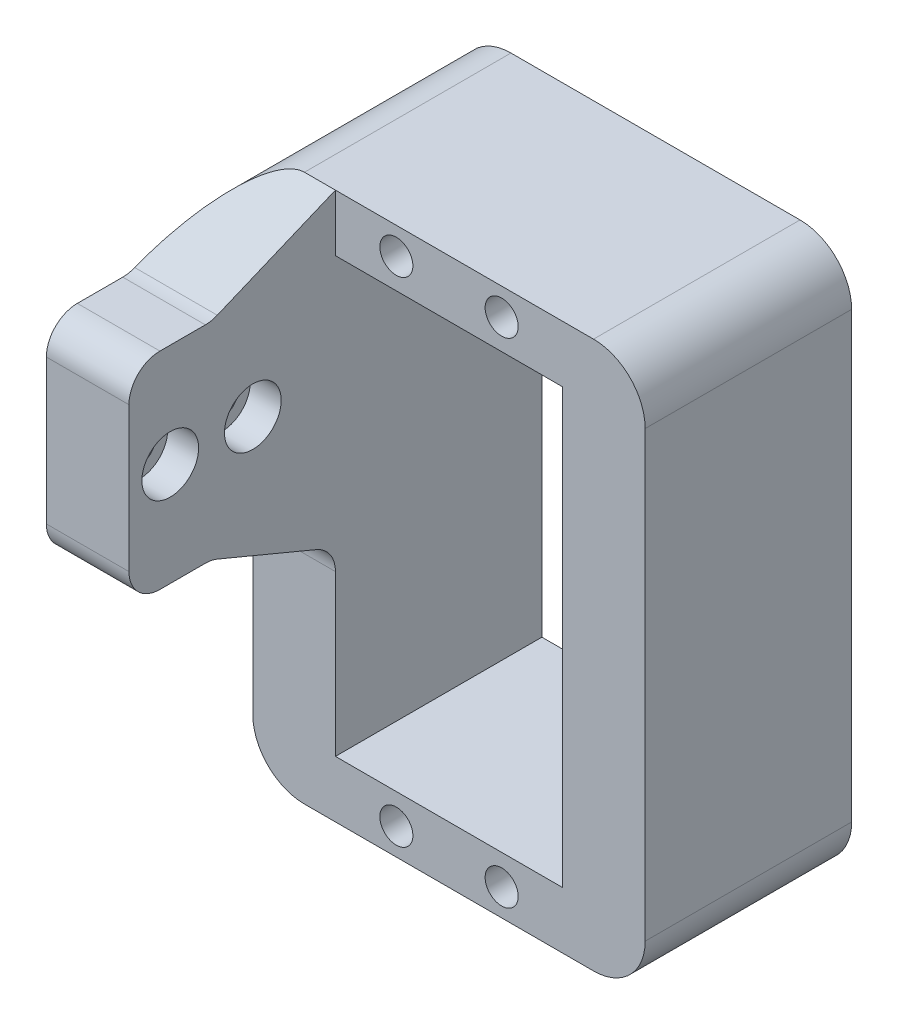
ISO-10303-21;
HEADER;
FILE_DESCRIPTION(('STEP AP214'),'2;1');
FILE_NAME('part.step','',(''),(''),'','','');
FILE_SCHEMA(('AUTOMOTIVE_DESIGN { 1 0 10303 214 1 1 1 1 }'));
ENDSEC;
DATA;
#1=APPLICATION_CONTEXT('core data for automotive mechanical design processes');
#2=APPLICATION_PROTOCOL_DEFINITION('international standard','automotive_design',2000,#1);
#3=PRODUCT_CONTEXT('',#1,'mechanical');
#4=PRODUCT('Part','Part','',(#3));
#5=PRODUCT_RELATED_PRODUCT_CATEGORY('part','',(#4));
#6=PRODUCT_DEFINITION_FORMATION('','',#4);
#7=PRODUCT_DEFINITION_CONTEXT('part definition',#1,'design');
#8=PRODUCT_DEFINITION('design','',#6,#7);
#9=PRODUCT_DEFINITION_SHAPE('','',#8);
#10=(LENGTH_UNIT() NAMED_UNIT(*) SI_UNIT(.MILLI.,.METRE.));
#11=(NAMED_UNIT(*) PLANE_ANGLE_UNIT() SI_UNIT($,.RADIAN.));
#12=(NAMED_UNIT(*) SI_UNIT($,.STERADIAN.) SOLID_ANGLE_UNIT());
#13=UNCERTAINTY_MEASURE_WITH_UNIT(LENGTH_MEASURE(1.E-05),#10,'distance_accuracy_value','');
#14=(GEOMETRIC_REPRESENTATION_CONTEXT(3) GLOBAL_UNCERTAINTY_ASSIGNED_CONTEXT((#13)) GLOBAL_UNIT_ASSIGNED_CONTEXT((#10,
#11,#12)) REPRESENTATION_CONTEXT('',''));
#15=CARTESIAN_POINT('',(0.,0.,0.));
#16=DIRECTION('',(0.,0.,1.));
#17=DIRECTION('',(1.,0.,0.));
#18=AXIS2_PLACEMENT_3D('',#15,#16,#17);
#19=CARTESIAN_POINT('',(0.,0.,20.));
#20=DIRECTION('',(0.,0.,1.));
#21=DIRECTION('',(1.,0.,0.));
#22=AXIS2_PLACEMENT_3D('',#19,#20,#21);
#23=PLANE('',#22);
#24=DIRECTION('',(0.,-1.,0.));
#25=VECTOR('',#24,1.);
#26=CARTESIAN_POINT('',(-19.,26.5,20.));
#27=LINE('',#26,#25);
#28=CARTESIAN_POINT('',(-19.,-5.5,20.));
#29=VERTEX_POINT('',#28);
#30=CARTESIAN_POINT('',(-19.,-21.5,20.));
#31=VERTEX_POINT('',#30);
#32=EDGE_CURVE('E199',#29,#31,#27,.T.);
#33=ORIENTED_EDGE('',*,*,#32,.T.);
#34=CARTESIAN_POINT('',(-14.,-21.5,20.));
#35=DIRECTION('',(0.,0.,1.));
#36=DIRECTION('',(1.,0.,0.));
#37=AXIS2_PLACEMENT_3D('',#34,#35,#36);
#38=CIRCLE('',#37,5.);
#39=CARTESIAN_POINT('',(-14.,-26.5,20.));
#40=VERTEX_POINT('',#39);
#41=EDGE_CURVE('E400',#31,#40,#38,.T.);
#42=ORIENTED_EDGE('',*,*,#41,.T.);
#43=DIRECTION('',(1.,0.,0.));
#44=VECTOR('',#43,1.);
#45=CARTESIAN_POINT('',(-19.,-26.5,20.));
#46=LINE('',#45,#44);
#47=CARTESIAN_POINT('',(14.,-26.5,20.));
#48=VERTEX_POINT('',#47);
#49=EDGE_CURVE('E217',#40,#48,#46,.T.);
#50=ORIENTED_EDGE('',*,*,#49,.T.);
#51=CARTESIAN_POINT('',(14.,-21.5,20.));
#52=DIRECTION('',(0.,0.,1.));
#53=DIRECTION('',(1.,0.,0.));
#54=AXIS2_PLACEMENT_3D('',#51,#52,#53);
#55=CIRCLE('',#54,5.);
#56=CARTESIAN_POINT('',(19.,-21.5,20.));
#57=VERTEX_POINT('',#56);
#58=EDGE_CURVE('E398',#48,#57,#55,.T.);
#59=ORIENTED_EDGE('',*,*,#58,.T.);
#60=DIRECTION('',(0.,1.,0.));
#61=VECTOR('',#60,1.);
#62=CARTESIAN_POINT('',(19.,26.5,20.));
#63=LINE('',#62,#61);
#64=CARTESIAN_POINT('',(19.,21.5,20.));
#65=VERTEX_POINT('',#64);
#66=EDGE_CURVE('E200',#57,#65,#63,.T.);
#67=ORIENTED_EDGE('',*,*,#66,.T.);
#68=CARTESIAN_POINT('',(14.,21.5,20.));
#69=DIRECTION('',(0.,0.,1.));
#70=DIRECTION('',(1.,0.,0.));
#71=AXIS2_PLACEMENT_3D('',#68,#69,#70);
#72=CIRCLE('',#71,5.);
#73=CARTESIAN_POINT('',(14.,26.5,20.));
#74=VERTEX_POINT('',#73);
#75=EDGE_CURVE('E196',#65,#74,#72,.T.);
#76=ORIENTED_EDGE('',*,*,#75,.T.);
#77=DIRECTION('',(-1.,0.,0.));
#78=VECTOR('',#77,1.);
#79=CARTESIAN_POINT('',(-19.,26.5,20.));
#80=LINE('',#79,#78);
#81=CARTESIAN_POINT('',(-11.,26.5,20.));
#82=VERTEX_POINT('',#81);
#83=EDGE_CURVE('E186',#74,#82,#80,.T.);
#84=ORIENTED_EDGE('',*,*,#83,.T.);
#85=DIRECTION('',(0.,1.,0.));
#86=VECTOR('',#85,1.);
#87=CARTESIAN_POINT('',(-11.,1.5,20.));
#88=LINE('',#87,#86);
#89=CARTESIAN_POINT('',(-11.,21.,20.));
#90=VERTEX_POINT('',#89);
#91=EDGE_CURVE('E192',#90,#82,#88,.T.);
#92=ORIENTED_EDGE('',*,*,#91,.F.);
#93=DIRECTION('',(-1.,0.,0.));
#94=VECTOR('',#93,1.);
#95=CARTESIAN_POINT('',(-11.,21.,20.));
#96=LINE('',#95,#94);
#97=CARTESIAN_POINT('',(11.,21.,20.));
#98=VERTEX_POINT('',#97);
#99=EDGE_CURVE('E297',#98,#90,#96,.T.);
#100=ORIENTED_EDGE('',*,*,#99,.F.);
#101=DIRECTION('',(0.,1.,0.));
#102=VECTOR('',#101,1.);
#103=CARTESIAN_POINT('',(11.,21.,20.));
#104=LINE('',#103,#102);
#105=CARTESIAN_POINT('',(11.,-21.,20.));
#106=VERTEX_POINT('',#105);
#107=EDGE_CURVE('E295',#106,#98,#104,.T.);
#108=ORIENTED_EDGE('',*,*,#107,.F.);
#109=DIRECTION('',(1.,0.,0.));
#110=VECTOR('',#109,1.);
#111=CARTESIAN_POINT('',(-11.,-21.,20.));
#112=LINE('',#111,#110);
#113=CARTESIAN_POINT('',(-11.,-21.,20.));
#114=VERTEX_POINT('',#113);
#115=EDGE_CURVE('E302',#114,#106,#112,.T.);
#116=ORIENTED_EDGE('',*,*,#115,.F.);
#117=DIRECTION('',(0.,-1.,0.));
#118=VECTOR('',#117,1.);
#119=CARTESIAN_POINT('',(-11.,21.,20.));
#120=LINE('',#119,#118);
#121=CARTESIAN_POINT('',(-11.,-5.49999999999999,20.));
#122=VERTEX_POINT('',#121);
#123=EDGE_CURVE('E300',#122,#114,#120,.T.);
#124=ORIENTED_EDGE('',*,*,#123,.F.);
#125=DIRECTION('',(-1.,0.,0.));
#126=VECTOR('',#125,1.);
#127=CARTESIAN_POINT('',(-19.,-5.5,20.));
#128=LINE('',#127,#126);
#129=EDGE_CURVE('E357',#122,#29,#128,.T.);
#130=ORIENTED_EDGE('',*,*,#129,.T.);
#131=EDGE_LOOP('',(#33,#42,#50,#59,#67,#76,#84,#92,#100,#108,#116,#124,#130));
#132=FACE_BOUND('',#131,.T.);
#133=CARTESIAN_POINT('',(-5.1,-23.8999999999999,20.));
#134=DIRECTION('',(0.,0.,1.));
#135=DIRECTION('',(1.,0.,0.));
#136=AXIS2_PLACEMENT_3D('',#133,#134,#135);
#137=CIRCLE('',#136,1.6);
#138=CARTESIAN_POINT('',(-3.5,-23.8999999999999,20.));
#139=VERTEX_POINT('',#138);
#140=EDGE_CURVE('E249',#139,#139,#137,.T.);
#141=ORIENTED_EDGE('',*,*,#140,.F.);
#142=EDGE_LOOP('',(#141));
#143=FACE_BOUND('',#142,.T.);
#144=CARTESIAN_POINT('',(5.1,23.9000000000001,20.));
#145=DIRECTION('',(0.,0.,1.));
#146=DIRECTION('',(1.,0.,0.));
#147=AXIS2_PLACEMENT_3D('',#144,#145,#146);
#148=CIRCLE('',#147,1.6);
#149=CARTESIAN_POINT('',(6.7,23.9000000000001,20.));
#150=VERTEX_POINT('',#149);
#151=EDGE_CURVE('E246',#150,#150,#148,.T.);
#152=ORIENTED_EDGE('',*,*,#151,.F.);
#153=EDGE_LOOP('',(#152));
#154=FACE_BOUND('',#153,.T.);
#155=CARTESIAN_POINT('',(-5.1,23.9000000000001,20.));
#156=DIRECTION('',(0.,0.,1.));
#157=DIRECTION('',(1.,0.,0.));
#158=AXIS2_PLACEMENT_3D('',#155,#156,#157);
#159=CIRCLE('',#158,1.6);
#160=CARTESIAN_POINT('',(-3.5,23.9000000000001,20.));
#161=VERTEX_POINT('',#160);
#162=EDGE_CURVE('E243',#161,#161,#159,.T.);
#163=ORIENTED_EDGE('',*,*,#162,.F.);
#164=EDGE_LOOP('',(#163));
#165=FACE_BOUND('',#164,.T.);
#166=CARTESIAN_POINT('',(5.1,-23.8999999999999,20.));
#167=DIRECTION('',(0.,0.,1.));
#168=DIRECTION('',(1.,0.,0.));
#169=AXIS2_PLACEMENT_3D('',#166,#167,#168);
#170=CIRCLE('',#169,1.6);
#171=CARTESIAN_POINT('',(6.69999999999999,-23.8999999999999,20.));
#172=VERTEX_POINT('',#171);
#173=EDGE_CURVE('E240',#172,#172,#170,.T.);
#174=ORIENTED_EDGE('',*,*,#173,.F.);
#175=EDGE_LOOP('',(#174));
#176=FACE_BOUND('',#175,.T.);
#177=ADVANCED_FACE('F33',(#132,#143,#154,#165,#176),#23,.T.);
#178=CARTESIAN_POINT('',(0.,0.,0.));
#179=DIRECTION('',(0.,0.,1.));
#180=DIRECTION('',(1.,0.,0.));
#181=AXIS2_PLACEMENT_3D('',#178,#179,#180);
#182=PLANE('',#181);
#183=CARTESIAN_POINT('',(-5.1,-23.8999999999999,0.));
#184=DIRECTION('',(0.,0.,-1.));
#185=DIRECTION('',(-1.,0.,0.));
#186=AXIS2_PLACEMENT_3D('',#183,#184,#185);
#187=CIRCLE('',#186,1.6);
#188=CARTESIAN_POINT('',(-6.7,-23.8999999999999,0.));
#189=VERTEX_POINT('',#188);
#190=EDGE_CURVE('E232',#189,#189,#187,.T.);
#191=ORIENTED_EDGE('',*,*,#190,.F.);
#192=EDGE_LOOP('',(#191));
#193=FACE_BOUND('',#192,.T.);
#194=CARTESIAN_POINT('',(5.1,23.9000000000001,0.));
#195=DIRECTION('',(0.,0.,-1.));
#196=DIRECTION('',(-1.,0.,0.));
#197=AXIS2_PLACEMENT_3D('',#194,#195,#196);
#198=CIRCLE('',#197,1.6);
#199=CARTESIAN_POINT('',(3.5,23.9000000000001,0.));
#200=VERTEX_POINT('',#199);
#201=EDGE_CURVE('E231',#200,#200,#198,.T.);
#202=ORIENTED_EDGE('',*,*,#201,.F.);
#203=EDGE_LOOP('',(#202));
#204=FACE_BOUND('',#203,.T.);
#205=CARTESIAN_POINT('',(-5.1,23.9000000000001,0.));
#206=DIRECTION('',(0.,0.,-1.));
#207=DIRECTION('',(-1.,0.,0.));
#208=AXIS2_PLACEMENT_3D('',#205,#206,#207);
#209=CIRCLE('',#208,1.6);
#210=CARTESIAN_POINT('',(-6.7,23.9000000000001,0.));
#211=VERTEX_POINT('',#210);
#212=EDGE_CURVE('E228',#211,#211,#209,.T.);
#213=ORIENTED_EDGE('',*,*,#212,.F.);
#214=EDGE_LOOP('',(#213));
#215=FACE_BOUND('',#214,.T.);
#216=CARTESIAN_POINT('',(5.1,-23.8999999999999,0.));
#217=DIRECTION('',(0.,0.,-1.));
#218=DIRECTION('',(-1.,0.,0.));
#219=AXIS2_PLACEMENT_3D('',#216,#217,#218);
#220=CIRCLE('',#219,1.6);
#221=CARTESIAN_POINT('',(3.5,-23.8999999999999,0.));
#222=VERTEX_POINT('',#221);
#223=EDGE_CURVE('E235',#222,#222,#220,.T.);
#224=ORIENTED_EDGE('',*,*,#223,.F.);
#225=EDGE_LOOP('',(#224));
#226=FACE_BOUND('',#225,.T.);
#227=DIRECTION('',(1.,0.,0.));
#228=VECTOR('',#227,1.);
#229=CARTESIAN_POINT('',(-19.,-26.5,0.));
#230=LINE('',#229,#228);
#231=CARTESIAN_POINT('',(-14.,-26.5,0.));
#232=VERTEX_POINT('',#231);
#233=CARTESIAN_POINT('',(14.,-26.5,0.));
#234=VERTEX_POINT('',#233);
#235=EDGE_CURVE('E324',#232,#234,#230,.T.);
#236=ORIENTED_EDGE('',*,*,#235,.F.);
#237=CARTESIAN_POINT('',(-14.,-21.5,0.));
#238=DIRECTION('',(0.,0.,1.));
#239=DIRECTION('',(1.,0.,0.));
#240=AXIS2_PLACEMENT_3D('',#237,#238,#239);
#241=CIRCLE('',#240,5.);
#242=CARTESIAN_POINT('',(-19.,-21.5,0.));
#243=VERTEX_POINT('',#242);
#244=EDGE_CURVE('E390',#232,#243,#241,.F.);
#245=ORIENTED_EDGE('',*,*,#244,.T.);
#246=DIRECTION('',(0.,-1.,0.));
#247=VECTOR('',#246,1.);
#248=CARTESIAN_POINT('',(-19.,26.5,0.));
#249=LINE('',#248,#247);
#250=CARTESIAN_POINT('',(-19.,21.5,0.));
#251=VERTEX_POINT('',#250);
#252=EDGE_CURVE('E333',#251,#243,#249,.T.);
#253=ORIENTED_EDGE('',*,*,#252,.F.);
#254=CARTESIAN_POINT('',(-14.,21.5,0.));
#255=DIRECTION('',(0.,0.,1.));
#256=DIRECTION('',(1.,0.,0.));
#257=AXIS2_PLACEMENT_3D('',#254,#255,#256);
#258=CIRCLE('',#257,5.);
#259=CARTESIAN_POINT('',(-14.,26.5,0.));
#260=VERTEX_POINT('',#259);
#261=EDGE_CURVE('E386',#251,#260,#258,.F.);
#262=ORIENTED_EDGE('',*,*,#261,.T.);
#263=DIRECTION('',(-1.,0.,0.));
#264=VECTOR('',#263,1.);
#265=CARTESIAN_POINT('',(-19.,26.5,0.));
#266=LINE('',#265,#264);
#267=CARTESIAN_POINT('',(14.,26.5,0.));
#268=VERTEX_POINT('',#267);
#269=EDGE_CURVE('E331',#268,#260,#266,.T.);
#270=ORIENTED_EDGE('',*,*,#269,.F.);
#271=CARTESIAN_POINT('',(14.,21.5,0.));
#272=DIRECTION('',(0.,0.,1.));
#273=DIRECTION('',(1.,0.,0.));
#274=AXIS2_PLACEMENT_3D('',#271,#272,#273);
#275=CIRCLE('',#274,5.);
#276=CARTESIAN_POINT('',(19.,21.5,0.));
#277=VERTEX_POINT('',#276);
#278=EDGE_CURVE('E384',#268,#277,#275,.F.);
#279=ORIENTED_EDGE('',*,*,#278,.T.);
#280=DIRECTION('',(0.,1.,0.));
#281=VECTOR('',#280,1.);
#282=CARTESIAN_POINT('',(19.,26.5,0.));
#283=LINE('',#282,#281);
#284=CARTESIAN_POINT('',(19.,-21.5,0.));
#285=VERTEX_POINT('',#284);
#286=EDGE_CURVE('E323',#285,#277,#283,.T.);
#287=ORIENTED_EDGE('',*,*,#286,.F.);
#288=CARTESIAN_POINT('',(14.,-21.5,0.));
#289=DIRECTION('',(0.,0.,1.));
#290=DIRECTION('',(1.,0.,0.));
#291=AXIS2_PLACEMENT_3D('',#288,#289,#290);
#292=CIRCLE('',#291,5.);
#293=EDGE_CURVE('E388',#285,#234,#292,.F.);
#294=ORIENTED_EDGE('',*,*,#293,.T.);
#295=EDGE_LOOP('',(#236,#245,#253,#262,#270,#279,#287,#294));
#296=FACE_BOUND('',#295,.T.);
#297=DIRECTION('',(0.,1.,0.));
#298=VECTOR('',#297,1.);
#299=CARTESIAN_POINT('',(11.,21.,0.));
#300=LINE('',#299,#298);
#301=CARTESIAN_POINT('',(11.,-21.,0.));
#302=VERTEX_POINT('',#301);
#303=CARTESIAN_POINT('',(11.,21.,0.));
#304=VERTEX_POINT('',#303);
#305=EDGE_CURVE('E294',#302,#304,#300,.T.);
#306=ORIENTED_EDGE('',*,*,#305,.T.);
#307=DIRECTION('',(-1.,0.,0.));
#308=VECTOR('',#307,1.);
#309=CARTESIAN_POINT('',(-11.,21.,0.));
#310=LINE('',#309,#308);
#311=CARTESIAN_POINT('',(-11.,21.,0.));
#312=VERTEX_POINT('',#311);
#313=EDGE_CURVE('E307',#304,#312,#310,.T.);
#314=ORIENTED_EDGE('',*,*,#313,.T.);
#315=DIRECTION('',(0.,-1.,0.));
#316=VECTOR('',#315,1.);
#317=CARTESIAN_POINT('',(-11.,21.,0.));
#318=LINE('',#317,#316);
#319=CARTESIAN_POINT('',(-11.,-21.,0.));
#320=VERTEX_POINT('',#319);
#321=EDGE_CURVE('E310',#312,#320,#318,.T.);
#322=ORIENTED_EDGE('',*,*,#321,.T.);
#323=DIRECTION('',(1.,0.,0.));
#324=VECTOR('',#323,1.);
#325=CARTESIAN_POINT('',(-11.,-21.,0.));
#326=LINE('',#325,#324);
#327=EDGE_CURVE('E298',#320,#302,#326,.T.);
#328=ORIENTED_EDGE('',*,*,#327,.T.);
#329=EDGE_LOOP('',(#306,#314,#322,#328));
#330=FACE_BOUND('',#329,.T.);
#331=ADVANCED_FACE('F413',(#193,#204,#215,#226,#296,#330),#182,.F.);
#332=CARTESIAN_POINT('',(19.,26.5,20.));
#333=DIRECTION('',(-1.,0.,0.));
#334=DIRECTION('',(0.,0.,1.));
#335=AXIS2_PLACEMENT_3D('',#332,#333,#334);
#336=PLANE('',#335);
#337=ORIENTED_EDGE('',*,*,#66,.F.);
#338=DIRECTION('',(0.,0.,-1.));
#339=VECTOR('',#338,1.);
#340=CARTESIAN_POINT('',(19.,-21.5,20.));
#341=LINE('',#340,#339);
#342=EDGE_CURVE('E404',#57,#285,#341,.T.);
#343=ORIENTED_EDGE('',*,*,#342,.T.);
#344=ORIENTED_EDGE('',*,*,#286,.T.);
#345=DIRECTION('',(0.,0.,-1.));
#346=VECTOR('',#345,1.);
#347=CARTESIAN_POINT('',(19.,21.5,20.));
#348=LINE('',#347,#346);
#349=EDGE_CURVE('E402',#277,#65,#348,.F.);
#350=ORIENTED_EDGE('',*,*,#349,.T.);
#351=EDGE_LOOP('',(#337,#343,#344,#350));
#352=FACE_BOUND('',#351,.T.);
#353=ADVANCED_FACE('F489',(#352),#336,.F.);
#354=CARTESIAN_POINT('',(-19.,26.5,20.));
#355=DIRECTION('',(0.,-1.,0.));
#356=DIRECTION('',(0.,0.,-1.));
#357=AXIS2_PLACEMENT_3D('',#354,#355,#356);
#358=PLANE('',#357);
#359=ORIENTED_EDGE('',*,*,#269,.T.);
#360=DIRECTION('',(0.,0.,-1.));
#361=VECTOR('',#360,1.);
#362=CARTESIAN_POINT('',(-14.,26.5,20.));
#363=LINE('',#362,#361);
#364=CARTESIAN_POINT('',(-14.,26.5,20.));
#365=VERTEX_POINT('',#364);
#366=EDGE_CURVE('E60',#260,#365,#363,.F.);
#367=ORIENTED_EDGE('',*,*,#366,.T.);
#368=DIRECTION('',(-1.,0.,0.));
#369=VECTOR('',#368,1.);
#370=CARTESIAN_POINT('',(2.00000000000001,26.5,20.));
#371=LINE('',#370,#369);
#372=EDGE_CURVE('E205',#82,#365,#371,.T.);
#373=ORIENTED_EDGE('',*,*,#372,.F.);
#374=ORIENTED_EDGE('',*,*,#83,.F.);
#375=DIRECTION('',(0.,0.,-1.));
#376=VECTOR('',#375,1.);
#377=CARTESIAN_POINT('',(14.,26.5,20.));
#378=LINE('',#377,#376);
#379=EDGE_CURVE('E407',#74,#268,#378,.T.);
#380=ORIENTED_EDGE('',*,*,#379,.T.);
#381=EDGE_LOOP('',(#359,#367,#373,#374,#380));
#382=FACE_BOUND('',#381,.T.);
#383=ADVANCED_FACE('F219',(#382),#358,.F.);
#384=CARTESIAN_POINT('',(-19.,26.5,20.));
#385=DIRECTION('',(1.,0.,0.));
#386=DIRECTION('',(0.,0.,-1.));
#387=AXIS2_PLACEMENT_3D('',#384,#385,#386);
#388=PLANE('',#387);
#389=ORIENTED_EDGE('',*,*,#252,.T.);
#390=DIRECTION('',(0.,0.,-1.));
#391=VECTOR('',#390,1.);
#392=CARTESIAN_POINT('',(-19.,-21.5,20.));
#393=LINE('',#392,#391);
#394=EDGE_CURVE('E395',#243,#31,#393,.F.);
#395=ORIENTED_EDGE('',*,*,#394,.T.);
#396=ORIENTED_EDGE('',*,*,#32,.F.);
#397=CARTESIAN_POINT('',(-19.,-5.5,23.));
#398=DIRECTION('',(1.,0.,0.));
#399=DIRECTION('',(0.,0.,-1.));
#400=AXIS2_PLACEMENT_3D('',#397,#398,#399);
#401=CIRCLE('',#400,3.);
#402=CARTESIAN_POINT('',(-19.,-2.73076923076923,21.8461538461538));
#403=VERTEX_POINT('',#402);
#404=EDGE_CURVE('E371',#29,#403,#401,.T.);
#405=ORIENTED_EDGE('',*,*,#404,.T.);
#406=DIRECTION('',(0.,0.384615384615385,0.923076923076923));
#407=VECTOR('',#406,1.);
#408=CARTESIAN_POINT('',(-19.,1.5,32.));
#409=LINE('',#408,#407);
#410=CARTESIAN_POINT('',(-19.,1.26923076923077,31.4461538461538));
#411=VERTEX_POINT('',#410);
#412=EDGE_CURVE('E220',#403,#411,#409,.T.);
#413=ORIENTED_EDGE('',*,*,#412,.T.);
#414=CARTESIAN_POINT('',(-19.,-1.5,32.6));
#415=DIRECTION('',(1.,0.,0.));
#416=DIRECTION('',(0.,0.,-1.));
#417=AXIS2_PLACEMENT_3D('',#414,#415,#416);
#418=CIRCLE('',#417,3.);
#419=CARTESIAN_POINT('',(-19.,1.5,32.6));
#420=VERTEX_POINT('',#419);
#421=EDGE_CURVE('E375',#411,#420,#418,.T.);
#422=ORIENTED_EDGE('',*,*,#421,.T.);
#423=DIRECTION('',(0.,0.,-1.));
#424=VECTOR('',#423,1.);
#425=CARTESIAN_POINT('',(-19.,1.5,40.));
#426=LINE('',#425,#424);
#427=CARTESIAN_POINT('',(-19.,1.5,37.));
#428=VERTEX_POINT('',#427);
#429=EDGE_CURVE('E291',#428,#420,#426,.T.);
#430=ORIENTED_EDGE('',*,*,#429,.F.);
#431=CARTESIAN_POINT('',(-19.,4.5,37.));
#432=DIRECTION('',(1.,0.,0.));
#433=DIRECTION('',(0.,0.,-1.));
#434=AXIS2_PLACEMENT_3D('',#431,#432,#433);
#435=CIRCLE('',#434,3.);
#436=CARTESIAN_POINT('',(-19.,4.5,40.));
#437=VERTEX_POINT('',#436);
#438=EDGE_CURVE('E349',#428,#437,#435,.F.);
#439=ORIENTED_EDGE('',*,*,#438,.T.);
#440=DIRECTION('',(0.,-1.,0.));
#441=VECTOR('',#440,1.);
#442=CARTESIAN_POINT('',(-19.,1.5,40.));
#443=LINE('',#442,#441);
#444=CARTESIAN_POINT('',(-19.,18.5,40.));
#445=VERTEX_POINT('',#444);
#446=EDGE_CURVE('E268',#445,#437,#443,.T.);
#447=ORIENTED_EDGE('',*,*,#446,.F.);
#448=CARTESIAN_POINT('',(-19.,18.5,37.));
#449=DIRECTION('',(1.,0.,0.));
#450=DIRECTION('',(0.,0.,-1.));
#451=AXIS2_PLACEMENT_3D('',#448,#449,#450);
#452=CIRCLE('',#451,3.);
#453=CARTESIAN_POINT('',(-19.,21.5,37.));
#454=VERTEX_POINT('',#453);
#455=EDGE_CURVE('E351',#445,#454,#452,.F.);
#456=ORIENTED_EDGE('',*,*,#455,.T.);
#457=DIRECTION('',(0.,0.,-1.));
#458=VECTOR('',#457,1.);
#459=CARTESIAN_POINT('',(-19.,21.5,40.));
#460=LINE('',#459,#458);
#461=CARTESIAN_POINT('',(-19.,21.5,32.6));
#462=VERTEX_POINT('',#461);
#463=EDGE_CURVE('E281',#454,#462,#460,.T.);
#464=ORIENTED_EDGE('',*,*,#463,.T.);
#465=DIRECTION('',(0.,0.,-1.));
#466=VECTOR('',#465,1.);
#467=CARTESIAN_POINT('',(-19.,21.5,20.));
#468=LINE('',#467,#466);
#469=EDGE_CURVE('E392',#462,#251,#468,.T.);
#470=ORIENTED_EDGE('',*,*,#469,.T.);
#471=EDGE_LOOP('',(#389,#395,#396,#405,#413,#422,#430,#439,#447,#456,#464,#470));
#472=FACE_BOUND('',#471,.T.);
#473=CARTESIAN_POINT('',(-19.,11.5,36.));
#474=DIRECTION('',(1.,0.,0.));
#475=DIRECTION('',(0.,0.,-1.));
#476=AXIS2_PLACEMENT_3D('',#473,#474,#475);
#477=CIRCLE('',#476,1.6);
#478=CARTESIAN_POINT('',(-19.,11.5,34.4));
#479=VERTEX_POINT('',#478);
#480=EDGE_CURVE('E253',#479,#479,#477,.T.);
#481=ORIENTED_EDGE('',*,*,#480,.T.);
#482=EDGE_LOOP('',(#481));
#483=FACE_BOUND('',#482,.T.);
#484=CARTESIAN_POINT('',(-19.,11.5,28.));
#485=DIRECTION('',(1.,0.,0.));
#486=DIRECTION('',(0.,0.,-1.));
#487=AXIS2_PLACEMENT_3D('',#484,#485,#486);
#488=CIRCLE('',#487,1.6);
#489=CARTESIAN_POINT('',(-19.,11.5,26.4));
#490=VERTEX_POINT('',#489);
#491=EDGE_CURVE('E252',#490,#490,#488,.T.);
#492=ORIENTED_EDGE('',*,*,#491,.T.);
#493=EDGE_LOOP('',(#492));
#494=FACE_BOUND('',#493,.T.);
#495=ADVANCED_FACE('F422',(#472,#483,#494),#388,.F.);
#496=CARTESIAN_POINT('',(-19.,-26.5,20.));
#497=DIRECTION('',(0.,1.,0.));
#498=DIRECTION('',(0.,0.,1.));
#499=AXIS2_PLACEMENT_3D('',#496,#497,#498);
#500=PLANE('',#499);
#501=ORIENTED_EDGE('',*,*,#49,.F.);
#502=DIRECTION('',(0.,0.,-1.));
#503=VECTOR('',#502,1.);
#504=CARTESIAN_POINT('',(-14.,-26.5,20.));
#505=LINE('',#504,#503);
#506=EDGE_CURVE('E381',#40,#232,#505,.T.);
#507=ORIENTED_EDGE('',*,*,#506,.T.);
#508=ORIENTED_EDGE('',*,*,#235,.T.);
#509=DIRECTION('',(0.,0.,-1.));
#510=VECTOR('',#509,1.);
#511=CARTESIAN_POINT('',(14.,-26.5,20.));
#512=LINE('',#511,#510);
#513=EDGE_CURVE('E379',#234,#48,#512,.F.);
#514=ORIENTED_EDGE('',*,*,#513,.T.);
#515=EDGE_LOOP('',(#501,#507,#508,#514));
#516=FACE_BOUND('',#515,.T.);
#517=ADVANCED_FACE('F482',(#516),#500,.F.);
#518=CARTESIAN_POINT('',(11.,21.,20.));
#519=DIRECTION('',(-1.,0.,0.));
#520=DIRECTION('',(0.,-1.,0.));
#521=AXIS2_PLACEMENT_3D('',#518,#519,#520);
#522=PLANE('',#521);
#523=ORIENTED_EDGE('',*,*,#305,.F.);
#524=DIRECTION('',(0.,0.,-1.));
#525=VECTOR('',#524,1.);
#526=CARTESIAN_POINT('',(11.,-21.,20.));
#527=LINE('',#526,#525);
#528=EDGE_CURVE('E304',#106,#302,#527,.T.);
#529=ORIENTED_EDGE('',*,*,#528,.F.);
#530=ORIENTED_EDGE('',*,*,#107,.T.);
#531=DIRECTION('',(0.,0.,-1.));
#532=VECTOR('',#531,1.);
#533=CARTESIAN_POINT('',(11.,21.,20.));
#534=LINE('',#533,#532);
#535=EDGE_CURVE('E320',#98,#304,#534,.T.);
#536=ORIENTED_EDGE('',*,*,#535,.T.);
#537=EDGE_LOOP('',(#523,#529,#530,#536));
#538=FACE_BOUND('',#537,.T.);
#539=ADVANCED_FACE('F471',(#538),#522,.T.);
#540=CARTESIAN_POINT('',(-11.,21.,20.));
#541=DIRECTION('',(0.,-1.,0.));
#542=DIRECTION('',(0.,0.,-1.));
#543=AXIS2_PLACEMENT_3D('',#540,#541,#542);
#544=PLANE('',#543);
#545=ORIENTED_EDGE('',*,*,#313,.F.);
#546=ORIENTED_EDGE('',*,*,#535,.F.);
#547=ORIENTED_EDGE('',*,*,#99,.T.);
#548=DIRECTION('',(0.,0.,-1.));
#549=VECTOR('',#548,1.);
#550=CARTESIAN_POINT('',(-11.,21.,20.));
#551=LINE('',#550,#549);
#552=EDGE_CURVE('E215',#90,#312,#551,.T.);
#553=ORIENTED_EDGE('',*,*,#552,.T.);
#554=EDGE_LOOP('',(#545,#546,#547,#553));
#555=FACE_BOUND('',#554,.T.);
#556=ADVANCED_FACE('F474',(#555),#544,.T.);
#557=CARTESIAN_POINT('',(-11.,21.,20.));
#558=DIRECTION('',(1.,0.,0.));
#559=DIRECTION('',(0.,0.,-1.));
#560=AXIS2_PLACEMENT_3D('',#557,#558,#559);
#561=PLANE('',#560);
#562=DIRECTION('',(0.,0.,-1.));
#563=VECTOR('',#562,1.);
#564=CARTESIAN_POINT('',(-11.,21.5,40.));
#565=LINE('',#564,#563);
#566=CARTESIAN_POINT('',(-11.,21.5,37.));
#567=VERTEX_POINT('',#566);
#568=CARTESIAN_POINT('',(-11.,21.5,32.6));
#569=VERTEX_POINT('',#568);
#570=EDGE_CURVE('E285',#567,#569,#565,.T.);
#571=ORIENTED_EDGE('',*,*,#570,.F.);
#572=CARTESIAN_POINT('',(-11.,18.5,37.));
#573=DIRECTION('',(1.,0.,0.));
#574=DIRECTION('',(0.,0.,-1.));
#575=AXIS2_PLACEMENT_3D('',#572,#573,#574);
#576=CIRCLE('',#575,3.);
#577=CARTESIAN_POINT('',(-11.,18.5,40.));
#578=VERTEX_POINT('',#577);
#579=EDGE_CURVE('E355',#567,#578,#576,.T.);
#580=ORIENTED_EDGE('',*,*,#579,.T.);
#581=DIRECTION('',(0.,1.,0.));
#582=VECTOR('',#581,1.);
#583=CARTESIAN_POINT('',(-11.,1.5,40.));
#584=LINE('',#583,#582);
#585=CARTESIAN_POINT('',(-11.,4.5,40.));
#586=VERTEX_POINT('',#585);
#587=EDGE_CURVE('E279',#586,#578,#584,.T.);
#588=ORIENTED_EDGE('',*,*,#587,.F.);
#589=CARTESIAN_POINT('',(-11.,4.5,37.));
#590=DIRECTION('',(1.,0.,0.));
#591=DIRECTION('',(0.,0.,-1.));
#592=AXIS2_PLACEMENT_3D('',#589,#590,#591);
#593=CIRCLE('',#592,3.);
#594=CARTESIAN_POINT('',(-11.,1.5,37.));
#595=VERTEX_POINT('',#594);
#596=EDGE_CURVE('E353',#586,#595,#593,.T.);
#597=ORIENTED_EDGE('',*,*,#596,.T.);
#598=DIRECTION('',(0.,0.,-1.));
#599=VECTOR('',#598,1.);
#600=CARTESIAN_POINT('',(-11.,1.5,40.));
#601=LINE('',#600,#599);
#602=CARTESIAN_POINT('',(-11.,1.5,32.6));
#603=VERTEX_POINT('',#602);
#604=EDGE_CURVE('E288',#595,#603,#601,.T.);
#605=ORIENTED_EDGE('',*,*,#604,.T.);
#606=CARTESIAN_POINT('',(-11.,-1.5,32.6));
#607=DIRECTION('',(1.,0.,0.));
#608=DIRECTION('',(0.,0.,-1.));
#609=AXIS2_PLACEMENT_3D('',#606,#607,#608);
#610=CIRCLE('',#609,3.);
#611=CARTESIAN_POINT('',(-11.,1.26923076923077,31.4461538461538));
#612=VERTEX_POINT('',#611);
#613=EDGE_CURVE('E377',#603,#612,#610,.F.);
#614=ORIENTED_EDGE('',*,*,#613,.T.);
#615=DIRECTION('',(0.,0.384615384615385,0.923076923076923));
#616=VECTOR('',#615,1.);
#617=CARTESIAN_POINT('',(-11.,1.5,32.));
#618=LINE('',#617,#616);
#619=CARTESIAN_POINT('',(-11.,-2.73076923076924,21.8461538461538));
#620=VERTEX_POINT('',#619);
#621=EDGE_CURVE('E223',#620,#612,#618,.T.);
#622=ORIENTED_EDGE('',*,*,#621,.F.);
#623=CARTESIAN_POINT('',(-11.,-5.5,23.));
#624=DIRECTION('',(1.,0.,0.));
#625=DIRECTION('',(0.,0.,-1.));
#626=AXIS2_PLACEMENT_3D('',#623,#624,#625);
#627=CIRCLE('',#626,3.);
#628=EDGE_CURVE('E373',#620,#122,#627,.F.);
#629=ORIENTED_EDGE('',*,*,#628,.T.);
#630=ORIENTED_EDGE('',*,*,#123,.T.);
#631=DIRECTION('',(0.,0.,-1.));
#632=VECTOR('',#631,1.);
#633=CARTESIAN_POINT('',(-11.,-21.,20.));
#634=LINE('',#633,#632);
#635=EDGE_CURVE('E317',#114,#320,#634,.T.);
#636=ORIENTED_EDGE('',*,*,#635,.T.);
#637=ORIENTED_EDGE('',*,*,#321,.F.);
#638=ORIENTED_EDGE('',*,*,#552,.F.);
#639=ORIENTED_EDGE('',*,*,#91,.T.);
#640=DIRECTION('',(0.,0.384615384615385,-0.923076923076923));
#641=VECTOR('',#640,1.);
#642=CARTESIAN_POINT('',(-11.,21.5,32.));
#643=LINE('',#642,#641);
#644=CARTESIAN_POINT('',(-11.,21.7307692307692,31.4461538461538));
#645=VERTEX_POINT('',#644);
#646=EDGE_CURVE('E203',#645,#82,#643,.T.);
#647=ORIENTED_EDGE('',*,*,#646,.F.);
#648=CARTESIAN_POINT('',(-11.,24.5,32.6));
#649=DIRECTION('',(1.,0.,0.));
#650=DIRECTION('',(0.,0.,-1.));
#651=AXIS2_PLACEMENT_3D('',#648,#649,#650);
#652=CIRCLE('',#651,3.);
#653=EDGE_CURVE('E369',#645,#569,#652,.F.);
#654=ORIENTED_EDGE('',*,*,#653,.T.);
#655=EDGE_LOOP('',(#571,#580,#588,#597,#605,#614,#622,#629,#630,#636,#637,#638,#639,#647,#654));
#656=FACE_BOUND('',#655,.T.);
#657=CARTESIAN_POINT('',(-11.,11.5,36.));
#658=DIRECTION('',(1.,0.,0.));
#659=DIRECTION('',(0.,0.,-1.));
#660=AXIS2_PLACEMENT_3D('',#657,#658,#659);
#661=CIRCLE('',#660,2.75);
#662=CARTESIAN_POINT('',(-11.,11.5,33.25));
#663=VERTEX_POINT('',#662);
#664=EDGE_CURVE('E269',#663,#663,#661,.T.);
#665=ORIENTED_EDGE('',*,*,#664,.F.);
#666=EDGE_LOOP('',(#665));
#667=FACE_BOUND('',#666,.T.);
#668=CARTESIAN_POINT('',(-11.,11.5,28.));
#669=DIRECTION('',(1.,0.,0.));
#670=DIRECTION('',(0.,0.,-1.));
#671=AXIS2_PLACEMENT_3D('',#668,#669,#670);
#672=CIRCLE('',#671,2.75);
#673=CARTESIAN_POINT('',(-11.,11.5,25.25));
#674=VERTEX_POINT('',#673);
#675=EDGE_CURVE('E264',#674,#674,#672,.T.);
#676=ORIENTED_EDGE('',*,*,#675,.F.);
#677=EDGE_LOOP('',(#676));
#678=FACE_BOUND('',#677,.T.);
#679=ADVANCED_FACE('F212',(#656,#667,#678),#561,.T.);
#680=CARTESIAN_POINT('',(-11.,-21.,20.));
#681=DIRECTION('',(0.,1.,0.));
#682=DIRECTION('',(0.,0.,1.));
#683=AXIS2_PLACEMENT_3D('',#680,#681,#682);
#684=PLANE('',#683);
#685=ORIENTED_EDGE('',*,*,#327,.F.);
#686=ORIENTED_EDGE('',*,*,#635,.F.);
#687=ORIENTED_EDGE('',*,*,#115,.T.);
#688=ORIENTED_EDGE('',*,*,#528,.T.);
#689=EDGE_LOOP('',(#685,#686,#687,#688));
#690=FACE_BOUND('',#689,.T.);
#691=ADVANCED_FACE('F469',(#690),#684,.T.);
#692=CARTESIAN_POINT('',(-19.,1.5,40.));
#693=DIRECTION('',(0.,1.,0.));
#694=DIRECTION('',(0.,0.,1.));
#695=AXIS2_PLACEMENT_3D('',#692,#693,#694);
#696=PLANE('',#695);
#697=ORIENTED_EDGE('',*,*,#604,.F.);
#698=DIRECTION('',(1.,0.,0.));
#699=VECTOR('',#698,1.);
#700=CARTESIAN_POINT('',(-19.,1.5,37.));
#701=LINE('',#700,#699);
#702=EDGE_CURVE('E367',#595,#428,#701,.F.);
#703=ORIENTED_EDGE('',*,*,#702,.T.);
#704=ORIENTED_EDGE('',*,*,#429,.T.);
#705=DIRECTION('',(-1.,0.,0.));
#706=VECTOR('',#705,1.);
#707=CARTESIAN_POINT('',(-19.,1.5,32.6));
#708=LINE('',#707,#706);
#709=EDGE_CURVE('E365',#420,#603,#708,.F.);
#710=ORIENTED_EDGE('',*,*,#709,.T.);
#711=EDGE_LOOP('',(#697,#703,#704,#710));
#712=FACE_BOUND('',#711,.T.);
#713=ADVANCED_FACE('F446',(#712),#696,.F.);
#714=CARTESIAN_POINT('',(-19.,21.5,40.));
#715=DIRECTION('',(0.,-1.,0.));
#716=DIRECTION('',(1.,0.,0.));
#717=AXIS2_PLACEMENT_3D('',#714,#715,#716);
#718=PLANE('',#717);
#719=ORIENTED_EDGE('',*,*,#570,.T.);
#720=DIRECTION('',(-1.,0.,0.));
#721=VECTOR('',#720,1.);
#722=CARTESIAN_POINT('',(-19.,21.5,32.6));
#723=LINE('',#722,#721);
#724=EDGE_CURVE('E339',#569,#462,#723,.T.);
#725=ORIENTED_EDGE('',*,*,#724,.T.);
#726=ORIENTED_EDGE('',*,*,#463,.F.);
#727=DIRECTION('',(-1.,0.,0.));
#728=VECTOR('',#727,1.);
#729=CARTESIAN_POINT('',(-19.,21.5,37.));
#730=LINE('',#729,#728);
#731=EDGE_CURVE('E216',#454,#567,#730,.F.);
#732=ORIENTED_EDGE('',*,*,#731,.T.);
#733=EDGE_LOOP('',(#719,#725,#726,#732));
#734=FACE_BOUND('',#733,.T.);
#735=ADVANCED_FACE('F429',(#734),#718,.F.);
#736=CARTESIAN_POINT('',(0.,0.,40.));
#737=DIRECTION('',(0.,0.,-1.));
#738=DIRECTION('',(-1.,0.,0.));
#739=AXIS2_PLACEMENT_3D('',#736,#737,#738);
#740=PLANE('',#739);
#741=ORIENTED_EDGE('',*,*,#587,.T.);
#742=DIRECTION('',(-1.,0.,0.));
#743=VECTOR('',#742,1.);
#744=CARTESIAN_POINT('',(0.,18.5,40.));
#745=LINE('',#744,#743);
#746=EDGE_CURVE('E346',#578,#445,#745,.T.);
#747=ORIENTED_EDGE('',*,*,#746,.T.);
#748=ORIENTED_EDGE('',*,*,#446,.T.);
#749=DIRECTION('',(1.,0.,0.));
#750=VECTOR('',#749,1.);
#751=CARTESIAN_POINT('',(0.,4.5,40.));
#752=LINE('',#751,#750);
#753=EDGE_CURVE('E343',#437,#586,#752,.T.);
#754=ORIENTED_EDGE('',*,*,#753,.T.);
#755=EDGE_LOOP('',(#741,#747,#748,#754));
#756=FACE_BOUND('',#755,.T.);
#757=ADVANCED_FACE('F437',(#756),#740,.F.);
#758=CARTESIAN_POINT('',(-14.,11.5,28.));
#759=DIRECTION('',(1.,0.,0.));
#760=DIRECTION('',(0.,0.,-1.));
#761=AXIS2_PLACEMENT_3D('',#758,#759,#760);
#762=CYLINDRICAL_SURFACE('',#761,2.75);
#763=CARTESIAN_POINT('',(-14.,11.5,28.));
#764=DIRECTION('',(1.,0.,0.));
#765=DIRECTION('',(0.,0.,-1.));
#766=AXIS2_PLACEMENT_3D('',#763,#764,#765);
#767=CIRCLE('',#766,2.75);
#768=CARTESIAN_POINT('',(-14.,11.5,25.25));
#769=VERTEX_POINT('',#768);
#770=EDGE_CURVE('E272',#769,#769,#767,.T.);
#771=ORIENTED_EDGE('',*,*,#770,.F.);
#772=EDGE_LOOP('',(#771));
#773=FACE_BOUND('',#772,.T.);
#774=ORIENTED_EDGE('',*,*,#675,.T.);
#775=EDGE_LOOP('',(#774));
#776=FACE_BOUND('',#775,.T.);
#777=ADVANCED_FACE('F659',(#773,#776),#762,.F.);
#778=CARTESIAN_POINT('',(-14.,11.5,28.));
#779=DIRECTION('',(1.,0.,0.));
#780=DIRECTION('',(0.,0.,-1.));
#781=AXIS2_PLACEMENT_3D('',#778,#779,#780);
#782=PLANE('',#781);
#783=CARTESIAN_POINT('',(-14.,11.5,28.));
#784=DIRECTION('',(1.,0.,0.));
#785=DIRECTION('',(0.,0.,-1.));
#786=AXIS2_PLACEMENT_3D('',#783,#784,#785);
#787=CIRCLE('',#786,1.6);
#788=CARTESIAN_POINT('',(-14.,11.5,26.4));
#789=VERTEX_POINT('',#788);
#790=EDGE_CURVE('E261',#789,#789,#787,.T.);
#791=ORIENTED_EDGE('',*,*,#790,.F.);
#792=EDGE_LOOP('',(#791));
#793=FACE_BOUND('',#792,.T.);
#794=ORIENTED_EDGE('',*,*,#770,.T.);
#795=EDGE_LOOP('',(#794));
#796=FACE_BOUND('',#795,.T.);
#797=ADVANCED_FACE('F752',(#793,#796),#782,.T.);
#798=CARTESIAN_POINT('',(-14.,11.5,36.));
#799=DIRECTION('',(1.,0.,0.));
#800=DIRECTION('',(0.,0.,-1.));
#801=AXIS2_PLACEMENT_3D('',#798,#799,#800);
#802=CYLINDRICAL_SURFACE('',#801,2.75);
#803=CARTESIAN_POINT('',(-14.,11.5,36.));
#804=DIRECTION('',(1.,0.,0.));
#805=DIRECTION('',(0.,0.,-1.));
#806=AXIS2_PLACEMENT_3D('',#803,#804,#805);
#807=CIRCLE('',#806,2.75);
#808=CARTESIAN_POINT('',(-14.,11.5,33.25));
#809=VERTEX_POINT('',#808);
#810=EDGE_CURVE('E265',#809,#809,#807,.T.);
#811=ORIENTED_EDGE('',*,*,#810,.F.);
#812=EDGE_LOOP('',(#811));
#813=FACE_BOUND('',#812,.T.);
#814=ORIENTED_EDGE('',*,*,#664,.T.);
#815=EDGE_LOOP('',(#814));
#816=FACE_BOUND('',#815,.T.);
#817=ADVANCED_FACE('F742',(#813,#816),#802,.F.);
#818=CARTESIAN_POINT('',(-14.,11.5,36.));
#819=DIRECTION('',(1.,0.,0.));
#820=DIRECTION('',(0.,0.,-1.));
#821=AXIS2_PLACEMENT_3D('',#818,#819,#820);
#822=PLANE('',#821);
#823=CARTESIAN_POINT('',(-14.,11.5,36.));
#824=DIRECTION('',(1.,0.,0.));
#825=DIRECTION('',(0.,0.,-1.));
#826=AXIS2_PLACEMENT_3D('',#823,#824,#825);
#827=CIRCLE('',#826,1.6);
#828=CARTESIAN_POINT('',(-14.,11.5,34.4));
#829=VERTEX_POINT('',#828);
#830=EDGE_CURVE('E256',#829,#829,#827,.T.);
#831=ORIENTED_EDGE('',*,*,#830,.F.);
#832=EDGE_LOOP('',(#831));
#833=FACE_BOUND('',#832,.T.);
#834=ORIENTED_EDGE('',*,*,#810,.T.);
#835=EDGE_LOOP('',(#834));
#836=FACE_BOUND('',#835,.T.);
#837=ADVANCED_FACE('F732',(#833,#836),#822,.T.);
#838=CARTESIAN_POINT('',(-19.,11.5,36.));
#839=DIRECTION('',(1.,0.,0.));
#840=DIRECTION('',(0.,0.,-1.));
#841=AXIS2_PLACEMENT_3D('',#838,#839,#840);
#842=CYLINDRICAL_SURFACE('',#841,1.6);
#843=ORIENTED_EDGE('',*,*,#830,.T.);
#844=EDGE_LOOP('',(#843));
#845=FACE_BOUND('',#844,.T.);
#846=ORIENTED_EDGE('',*,*,#480,.F.);
#847=EDGE_LOOP('',(#846));
#848=FACE_BOUND('',#847,.T.);
#849=ADVANCED_FACE('F722',(#845,#848),#842,.F.);
#850=CARTESIAN_POINT('',(-19.,11.5,28.));
#851=DIRECTION('',(1.,0.,0.));
#852=DIRECTION('',(0.,0.,-1.));
#853=AXIS2_PLACEMENT_3D('',#850,#851,#852);
#854=CYLINDRICAL_SURFACE('',#853,1.6);
#855=ORIENTED_EDGE('',*,*,#790,.T.);
#856=EDGE_LOOP('',(#855));
#857=FACE_BOUND('',#856,.T.);
#858=ORIENTED_EDGE('',*,*,#491,.F.);
#859=EDGE_LOOP('',(#858));
#860=FACE_BOUND('',#859,.T.);
#861=ADVANCED_FACE('F712',(#857,#860),#854,.F.);
#862=CARTESIAN_POINT('',(5.1,-23.8999999999999,40.));
#863=DIRECTION('',(0.,0.,-1.));
#864=DIRECTION('',(-1.,0.,0.));
#865=AXIS2_PLACEMENT_3D('',#862,#863,#864);
#866=CYLINDRICAL_SURFACE('',#865,1.6);
#867=ORIENTED_EDGE('',*,*,#173,.T.);
#868=EDGE_LOOP('',(#867));
#869=FACE_BOUND('',#868,.T.);
#870=ORIENTED_EDGE('',*,*,#223,.T.);
#871=EDGE_LOOP('',(#870));
#872=FACE_BOUND('',#871,.T.);
#873=ADVANCED_FACE('F702',(#869,#872),#866,.F.);
#874=CARTESIAN_POINT('',(-5.1,23.9000000000001,40.));
#875=DIRECTION('',(0.,0.,-1.));
#876=DIRECTION('',(-1.,0.,0.));
#877=AXIS2_PLACEMENT_3D('',#874,#875,#876);
#878=CYLINDRICAL_SURFACE('',#877,1.6);
#879=ORIENTED_EDGE('',*,*,#162,.T.);
#880=EDGE_LOOP('',(#879));
#881=FACE_BOUND('',#880,.T.);
#882=ORIENTED_EDGE('',*,*,#212,.T.);
#883=EDGE_LOOP('',(#882));
#884=FACE_BOUND('',#883,.T.);
#885=ADVANCED_FACE('F692',(#881,#884),#878,.F.);
#886=CARTESIAN_POINT('',(5.1,23.9000000000001,40.));
#887=DIRECTION('',(0.,0.,-1.));
#888=DIRECTION('',(-1.,0.,0.));
#889=AXIS2_PLACEMENT_3D('',#886,#887,#888);
#890=CYLINDRICAL_SURFACE('',#889,1.6);
#891=ORIENTED_EDGE('',*,*,#151,.T.);
#892=EDGE_LOOP('',(#891));
#893=FACE_BOUND('',#892,.T.);
#894=ORIENTED_EDGE('',*,*,#201,.T.);
#895=EDGE_LOOP('',(#894));
#896=FACE_BOUND('',#895,.T.);
#897=ADVANCED_FACE('F682',(#893,#896),#890,.F.);
#898=CARTESIAN_POINT('',(-5.1,-23.8999999999999,40.));
#899=DIRECTION('',(0.,0.,-1.));
#900=DIRECTION('',(-1.,0.,0.));
#901=AXIS2_PLACEMENT_3D('',#898,#899,#900);
#902=CYLINDRICAL_SURFACE('',#901,1.6);
#903=ORIENTED_EDGE('',*,*,#140,.T.);
#904=EDGE_LOOP('',(#903));
#905=FACE_BOUND('',#904,.T.);
#906=ORIENTED_EDGE('',*,*,#190,.T.);
#907=EDGE_LOOP('',(#906));
#908=FACE_BOUND('',#907,.T.);
#909=ADVANCED_FACE('F650',(#905,#908),#902,.F.);
#910=CARTESIAN_POINT('',(2.00000000000001,1.5,32.));
#911=DIRECTION('',(0.,-0.923076923076923,0.384615384615385));
#912=DIRECTION('',(0.,-0.384615384615385,-0.923076923076923));
#913=AXIS2_PLACEMENT_3D('',#910,#911,#912);
#914=PLANE('',#913);
#915=ORIENTED_EDGE('',*,*,#412,.F.);
#916=DIRECTION('',(-1.,0.,0.));
#917=VECTOR('',#916,1.);
#918=CARTESIAN_POINT('',(-11.,-2.73076923076923,21.8461538461538));
#919=LINE('',#918,#917);
#920=EDGE_CURVE('E363',#403,#620,#919,.F.);
#921=ORIENTED_EDGE('',*,*,#920,.T.);
#922=ORIENTED_EDGE('',*,*,#621,.T.);
#923=DIRECTION('',(-1.,0.,0.));
#924=VECTOR('',#923,1.);
#925=CARTESIAN_POINT('',(2.00000000000001,1.26923076923077,31.4461538461538));
#926=LINE('',#925,#924);
#927=EDGE_CURVE('E360',#612,#411,#926,.T.);
#928=ORIENTED_EDGE('',*,*,#927,.T.);
#929=EDGE_LOOP('',(#915,#921,#922,#928));
#930=FACE_BOUND('',#929,.T.);
#931=ADVANCED_FACE('F456',(#930),#914,.T.);
#932=CARTESIAN_POINT('',(2.00000000000001,21.5,32.));
#933=DIRECTION('',(0.,0.923076923076923,0.384615384615385));
#934=DIRECTION('',(0.,-0.384615384615385,0.923076923076923));
#935=AXIS2_PLACEMENT_3D('',#932,#933,#934);
#936=PLANE('',#935);
#937=ORIENTED_EDGE('',*,*,#372,.T.);
#938=CARTESIAN_POINT('',(-14.,21.5,32.));
#939=DIRECTION('',(0.,0.923076923076923,0.384615384615385));
#940=DIRECTION('',(0.,0.384615384615385,-0.923076923076923));
#941=AXIS2_PLACEMENT_3D('',#938,#939,#940);
#942=ELLIPSE('',#941,13.,5.);
#943=CARTESIAN_POINT('',(-18.9946717171532,21.7307692307692,31.4461538461539));
#944=VERTEX_POINT('',#943);
#945=EDGE_CURVE('E46',#365,#944,#942,.T.);
#946=ORIENTED_EDGE('',*,*,#945,.T.);
#947=DIRECTION('',(-1.,0.,0.));
#948=VECTOR('',#947,1.);
#949=CARTESIAN_POINT('',(2.,21.7307692307692,31.4461538461538));
#950=LINE('',#949,#948);
#951=EDGE_CURVE('E206',#944,#645,#950,.F.);
#952=ORIENTED_EDGE('',*,*,#951,.T.);
#953=ORIENTED_EDGE('',*,*,#646,.T.);
#954=EDGE_LOOP('',(#937,#946,#952,#953));
#955=FACE_BOUND('',#954,.T.);
#956=ADVANCED_FACE('F204',(#955),#936,.T.);
#957=CARTESIAN_POINT('',(-19.,24.5,32.6));
#958=DIRECTION('',(-1.,0.,0.));
#959=DIRECTION('',(0.,0.,1.));
#960=AXIS2_PLACEMENT_3D('',#957,#958,#959);
#961=CYLINDRICAL_SURFACE('',#960,3.);
#962=ORIENTED_EDGE('',*,*,#951,.F.);
#963=CARTESIAN_POINT('',(-18.9946717171532,21.7307692307692,31.4461538461539));
#964=CARTESIAN_POINT('',(-18.9964116298207,21.6926123417549,31.5376877579959));
#965=CARTESIAN_POINT('',(-18.997548396298,21.6590233101536,31.6311285564625));
#966=CARTESIAN_POINT('',(-18.9990567337395,21.6015239128304,31.8199622942526));
#967=CARTESIAN_POINT('',(-18.9994355886555,21.5775232069446,31.9153276653021));
#968=CARTESIAN_POINT('',(-18.9998855378014,21.5389972205027,32.107953116127));
#969=CARTESIAN_POINT('',(-18.9999566330715,21.5244719079229,32.2052131894979));
#970=CARTESIAN_POINT('',(-19.0000001089797,21.5049184051497,32.4016415187791));
#971=CARTESIAN_POINT('',(-18.9999715204335,21.4999841886235,32.5008191336784));
#972=CARTESIAN_POINT('',(-19.,21.5,32.6));
#973=B_SPLINE_CURVE_WITH_KNOTS('',3,(#963,#964,#965,#966,#967,#968,#969,#970,#971,#972),
.UNSPECIFIED.,.F.,.F.,(4,2,2,2,4),(0.,0.297416373106557,0.591960407844016,0.886503447116862,
1.18391815789166),.UNSPECIFIED.);
#974=EDGE_CURVE('E11',#944,#462,#973,.T.);
#975=ORIENTED_EDGE('',*,*,#974,.T.);
#976=ORIENTED_EDGE('',*,*,#724,.F.);
#977=ORIENTED_EDGE('',*,*,#653,.F.);
#978=EDGE_LOOP('',(#962,#975,#976,#977));
#979=FACE_BOUND('',#978,.T.);
#980=ADVANCED_FACE('F502',(#979),#961,.F.);
#981=CARTESIAN_POINT('',(0.,18.5,37.));
#982=DIRECTION('',(-1.,0.,0.));
#983=DIRECTION('',(0.,-1.,0.));
#984=AXIS2_PLACEMENT_3D('',#981,#982,#983);
#985=CYLINDRICAL_SURFACE('',#984,3.);
#986=ORIENTED_EDGE('',*,*,#579,.F.);
#987=ORIENTED_EDGE('',*,*,#731,.F.);
#988=ORIENTED_EDGE('',*,*,#455,.F.);
#989=ORIENTED_EDGE('',*,*,#746,.F.);
#990=EDGE_LOOP('',(#986,#987,#988,#989));
#991=FACE_BOUND('',#990,.T.);
#992=ADVANCED_FACE('F433',(#991),#985,.T.);
#993=CARTESIAN_POINT('',(0.,-5.5,23.));
#994=DIRECTION('',(1.,0.,0.));
#995=DIRECTION('',(0.,0.,-1.));
#996=AXIS2_PLACEMENT_3D('',#993,#994,#995);
#997=CYLINDRICAL_SURFACE('',#996,3.);
#998=ORIENTED_EDGE('',*,*,#628,.F.);
#999=ORIENTED_EDGE('',*,*,#920,.F.);
#1000=ORIENTED_EDGE('',*,*,#404,.F.);
#1001=ORIENTED_EDGE('',*,*,#129,.F.);
#1002=EDGE_LOOP('',(#998,#999,#1000,#1001));
#1003=FACE_BOUND('',#1002,.T.);
#1004=ADVANCED_FACE('F459',(#1003),#997,.F.);
#1005=CARTESIAN_POINT('',(0.,4.5,37.));
#1006=DIRECTION('',(1.,0.,0.));
#1007=DIRECTION('',(0.,0.,-1.));
#1008=AXIS2_PLACEMENT_3D('',#1005,#1006,#1007);
#1009=CYLINDRICAL_SURFACE('',#1008,3.);
#1010=ORIENTED_EDGE('',*,*,#438,.F.);
#1011=ORIENTED_EDGE('',*,*,#702,.F.);
#1012=ORIENTED_EDGE('',*,*,#596,.F.);
#1013=ORIENTED_EDGE('',*,*,#753,.F.);
#1014=EDGE_LOOP('',(#1010,#1011,#1012,#1013));
#1015=FACE_BOUND('',#1014,.T.);
#1016=ADVANCED_FACE('F441',(#1015),#1009,.T.);
#1017=CARTESIAN_POINT('',(2.00000000000001,-1.5,32.6));
#1018=DIRECTION('',(-1.,0.,0.));
#1019=DIRECTION('',(0.,0.,1.));
#1020=AXIS2_PLACEMENT_3D('',#1017,#1018,#1019);
#1021=CYLINDRICAL_SURFACE('',#1020,3.);
#1022=ORIENTED_EDGE('',*,*,#613,.F.);
#1023=ORIENTED_EDGE('',*,*,#709,.F.);
#1024=ORIENTED_EDGE('',*,*,#421,.F.);
#1025=ORIENTED_EDGE('',*,*,#927,.F.);
#1026=EDGE_LOOP('',(#1022,#1023,#1024,#1025));
#1027=FACE_BOUND('',#1026,.T.);
#1028=ADVANCED_FACE('F450',(#1027),#1021,.F.);
#1029=CARTESIAN_POINT('',(-14.,-21.5,20.));
#1030=DIRECTION('',(0.,0.,-1.));
#1031=DIRECTION('',(-1.,0.,0.));
#1032=AXIS2_PLACEMENT_3D('',#1029,#1030,#1031);
#1033=CYLINDRICAL_SURFACE('',#1032,5.);
#1034=ORIENTED_EDGE('',*,*,#41,.F.);
#1035=ORIENTED_EDGE('',*,*,#394,.F.);
#1036=ORIENTED_EDGE('',*,*,#244,.F.);
#1037=ORIENTED_EDGE('',*,*,#506,.F.);
#1038=EDGE_LOOP('',(#1034,#1035,#1036,#1037));
#1039=FACE_BOUND('',#1038,.T.);
#1040=ADVANCED_FACE('F515',(#1039),#1033,.T.);
#1041=CARTESIAN_POINT('',(14.,-21.5,20.));
#1042=DIRECTION('',(0.,0.,-1.));
#1043=DIRECTION('',(-1.,0.,0.));
#1044=AXIS2_PLACEMENT_3D('',#1041,#1042,#1043);
#1045=CYLINDRICAL_SURFACE('',#1044,5.);
#1046=ORIENTED_EDGE('',*,*,#58,.F.);
#1047=ORIENTED_EDGE('',*,*,#513,.F.);
#1048=ORIENTED_EDGE('',*,*,#293,.F.);
#1049=ORIENTED_EDGE('',*,*,#342,.F.);
#1050=EDGE_LOOP('',(#1046,#1047,#1048,#1049));
#1051=FACE_BOUND('',#1050,.T.);
#1052=ADVANCED_FACE('F518',(#1051),#1045,.T.);
#1053=CARTESIAN_POINT('',(-14.,21.5,20.));
#1054=DIRECTION('',(0.,0.,-1.));
#1055=DIRECTION('',(-1.,0.,0.));
#1056=AXIS2_PLACEMENT_3D('',#1053,#1054,#1055);
#1057=CYLINDRICAL_SURFACE('',#1056,5.);
#1058=ORIENTED_EDGE('',*,*,#945,.F.);
#1059=ORIENTED_EDGE('',*,*,#366,.F.);
#1060=ORIENTED_EDGE('',*,*,#261,.F.);
#1061=ORIENTED_EDGE('',*,*,#469,.F.);
#1062=ORIENTED_EDGE('',*,*,#974,.F.);
#1063=EDGE_LOOP('',(#1058,#1059,#1060,#1061,#1062));
#1064=FACE_BOUND('',#1063,.T.);
#1065=ADVANCED_FACE('F419',(#1064),#1057,.T.);
#1066=CARTESIAN_POINT('',(14.,21.5,20.));
#1067=DIRECTION('',(0.,0.,-1.));
#1068=DIRECTION('',(-1.,0.,0.));
#1069=AXIS2_PLACEMENT_3D('',#1066,#1067,#1068);
#1070=CYLINDRICAL_SURFACE('',#1069,5.);
#1071=ORIENTED_EDGE('',*,*,#75,.F.);
#1072=ORIENTED_EDGE('',*,*,#349,.F.);
#1073=ORIENTED_EDGE('',*,*,#278,.F.);
#1074=ORIENTED_EDGE('',*,*,#379,.F.);
#1075=EDGE_LOOP('',(#1071,#1072,#1073,#1074));
#1076=FACE_BOUND('',#1075,.T.);
#1077=ADVANCED_FACE('F35',(#1076),#1070,.T.);
#1078=CLOSED_SHELL('',(#177,#331,#353,#383,#495,#517,#539,#556,#679,#691,#713,#735,#757,#777,
#797,#817,#837,#849,#861,#873,#885,#897,#909,#931,#956,#980,#992,#1004,#1016,#1028,#1040,#1052,
#1065,#1077));
#1079=MANIFOLD_SOLID_BREP('B2',#1078);
#1080=ADVANCED_BREP_SHAPE_REPRESENTATION('',(#18,#1079),#14);
#1081=SHAPE_DEFINITION_REPRESENTATION(#9,#1080);
ENDSEC;
END-ISO-10303-21;
